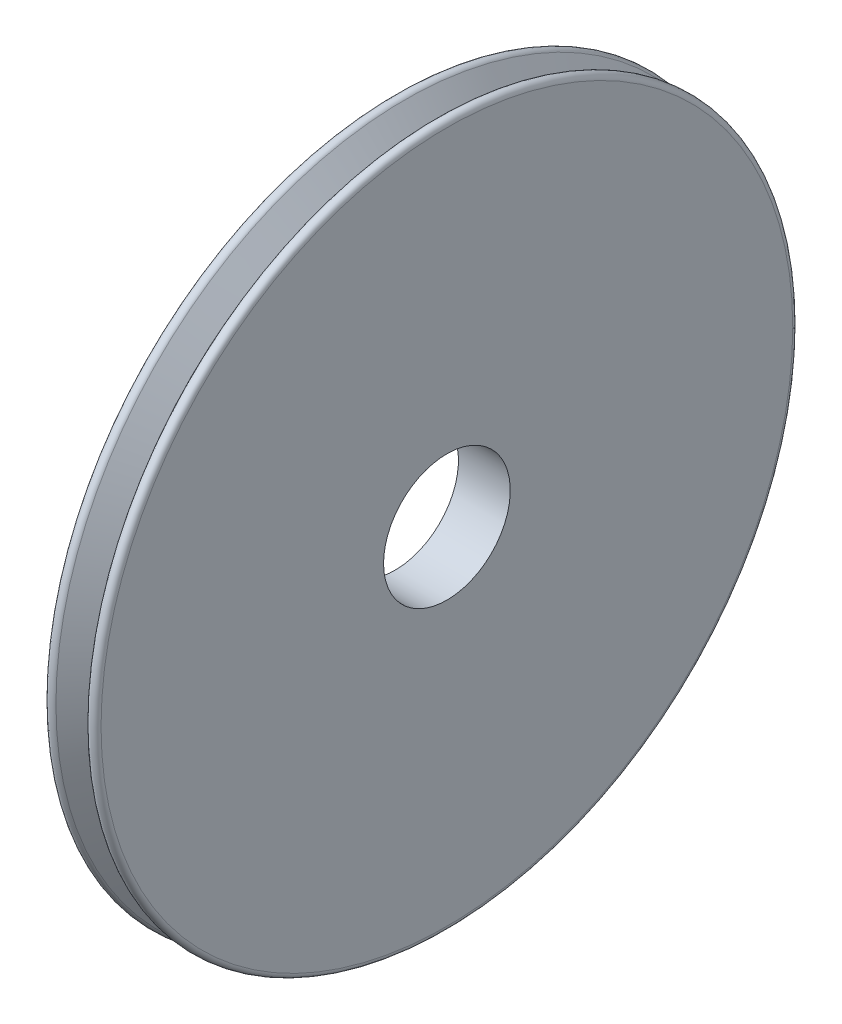
ISO-10303-21;
HEADER;
FILE_DESCRIPTION(('STEP AP214'),'2;1');
FILE_NAME('part.step','',(''),(''),'','','');
FILE_SCHEMA(('AUTOMOTIVE_DESIGN { 1 0 10303 214 1 1 1 1 }'));
ENDSEC;
DATA;
#1=APPLICATION_CONTEXT('core data for automotive mechanical design processes');
#2=APPLICATION_PROTOCOL_DEFINITION('international standard','automotive_design',2000,#1);
#3=PRODUCT_CONTEXT('',#1,'mechanical');
#4=PRODUCT('Part','Part','',(#3));
#5=PRODUCT_RELATED_PRODUCT_CATEGORY('part','',(#4));
#6=PRODUCT_DEFINITION_FORMATION('','',#4);
#7=PRODUCT_DEFINITION_CONTEXT('part definition',#1,'design');
#8=PRODUCT_DEFINITION('design','',#6,#7);
#9=PRODUCT_DEFINITION_SHAPE('','',#8);
#10=(LENGTH_UNIT() NAMED_UNIT(*) SI_UNIT(.MILLI.,.METRE.));
#11=(NAMED_UNIT(*) PLANE_ANGLE_UNIT() SI_UNIT($,.RADIAN.));
#12=(NAMED_UNIT(*) SI_UNIT($,.STERADIAN.) SOLID_ANGLE_UNIT());
#13=UNCERTAINTY_MEASURE_WITH_UNIT(LENGTH_MEASURE(1.E-05),#10,'distance_accuracy_value','');
#14=(GEOMETRIC_REPRESENTATION_CONTEXT(3) GLOBAL_UNCERTAINTY_ASSIGNED_CONTEXT((#13)) GLOBAL_UNIT_ASSIGNED_CONTEXT((#10,
#11,#12)) REPRESENTATION_CONTEXT('',''));
#15=CARTESIAN_POINT('',(0.,0.,0.));
#16=DIRECTION('',(0.,0.,1.));
#17=DIRECTION('',(1.,0.,0.));
#18=AXIS2_PLACEMENT_3D('',#15,#16,#17);
#19=CARTESIAN_POINT('',(-3.57,0.,0.));
#20=DIRECTION('',(-1.,0.,0.));
#21=DIRECTION('',(0.,0.,1.));
#22=AXIS2_PLACEMENT_3D('',#19,#20,#21);
#23=PLANE('',#22);
#24=CARTESIAN_POINT('',(-3.57,0.,0.));
#25=DIRECTION('',(-1.,0.,0.));
#26=DIRECTION('',(0.,0.,1.));
#27=AXIS2_PLACEMENT_3D('',#24,#25,#26);
#28=CIRCLE('',#27,8.73);
#29=CARTESIAN_POINT('',(-3.57,0.,8.73));
#30=VERTEX_POINT('',#29);
#31=EDGE_CURVE('E73',#30,#30,#28,.T.);
#32=ORIENTED_EDGE('',*,*,#31,.F.);
#33=EDGE_LOOP('',(#32));
#34=FACE_BOUND('',#33,.T.);
#35=CARTESIAN_POINT('',(-3.57,0.,0.));
#36=DIRECTION('',(-1.,0.,0.));
#37=DIRECTION('',(0.,0.,1.));
#38=AXIS2_PLACEMENT_3D('',#35,#36,#37);
#39=CIRCLE('',#38,47.6588891139517);
#40=CARTESIAN_POINT('',(-3.57,0.,47.6588891139517));
#41=VERTEX_POINT('',#40);
#42=EDGE_CURVE('E65',#41,#41,#39,.T.);
#43=ORIENTED_EDGE('',*,*,#42,.T.);
#44=EDGE_LOOP('',(#43));
#45=FACE_BOUND('',#44,.T.);
#46=ADVANCED_FACE('F45',(#34,#45),#23,.T.);
#47=CARTESIAN_POINT('',(3.57,0.,0.));
#48=DIRECTION('',(-1.,0.,0.));
#49=DIRECTION('',(0.,0.,1.));
#50=AXIS2_PLACEMENT_3D('',#47,#48,#49);
#51=PLANE('',#50);
#52=CARTESIAN_POINT('',(3.57,0.,0.));
#53=DIRECTION('',(-1.,0.,0.));
#54=DIRECTION('',(0.,0.,1.));
#55=AXIS2_PLACEMENT_3D('',#52,#53,#54);
#56=CIRCLE('',#55,8.73);
#57=CARTESIAN_POINT('',(3.57,0.,8.73));
#58=VERTEX_POINT('',#57);
#59=EDGE_CURVE('E49',#58,#58,#56,.T.);
#60=ORIENTED_EDGE('',*,*,#59,.T.);
#61=EDGE_LOOP('',(#60));
#62=FACE_BOUND('',#61,.T.);
#63=CARTESIAN_POINT('',(3.57,0.,0.));
#64=DIRECTION('',(-1.,0.,0.));
#65=DIRECTION('',(0.,0.,1.));
#66=AXIS2_PLACEMENT_3D('',#63,#64,#65);
#67=CIRCLE('',#66,47.6588891139518);
#68=CARTESIAN_POINT('',(3.57,0.,47.6588891139518));
#69=VERTEX_POINT('',#68);
#70=EDGE_CURVE('E10',#69,#69,#67,.F.);
#71=ORIENTED_EDGE('',*,*,#70,.T.);
#72=EDGE_LOOP('',(#71));
#73=FACE_BOUND('',#72,.T.);
#74=ADVANCED_FACE('F82',(#62,#73),#51,.F.);
#75=CARTESIAN_POINT('',(3.57,0.,0.));
#76=DIRECTION('',(1.,0.,0.));
#77=DIRECTION('',(0.,0.,-1.));
#78=AXIS2_PLACEMENT_3D('',#75,#76,#77);
#79=CONICAL_SURFACE('',#78,50.,0.950736055568568);
#80=CARTESIAN_POINT('',(2.20961742338803,0.,0.));
#81=DIRECTION('',(-1.,0.,0.));
#82=DIRECTION('',(0.,0.,1.));
#83=AXIS2_PLACEMENT_3D('',#80,#81,#82);
#84=CIRCLE('',#83,48.0947022736527);
#85=CARTESIAN_POINT('',(2.20961742338803,0.,48.0947022736527));
#86=VERTEX_POINT('',#85);
#87=EDGE_CURVE('E54',#86,#86,#84,.T.);
#88=ORIENTED_EDGE('',*,*,#87,.T.);
#89=EDGE_LOOP('',(#88));
#90=FACE_BOUND('',#89,.T.);
#91=CARTESIAN_POINT('',(0.,0.,0.));
#92=DIRECTION('',(-1.,0.,0.));
#93=DIRECTION('',(0.,0.,1.));
#94=AXIS2_PLACEMENT_3D('',#91,#92,#93);
#95=CIRCLE('',#94,45.);
#96=CARTESIAN_POINT('',(0.,0.,45.));
#97=VERTEX_POINT('',#96);
#98=EDGE_CURVE('E69',#97,#97,#95,.T.);
#99=ORIENTED_EDGE('',*,*,#98,.F.);
#100=EDGE_LOOP('',(#99));
#101=FACE_BOUND('',#100,.T.);
#102=ADVANCED_FACE('F99',(#90,#101),#79,.T.);
#103=CARTESIAN_POINT('',(-3.57,0.,0.));
#104=DIRECTION('',(-1.,0.,0.));
#105=DIRECTION('',(0.,0.,1.));
#106=AXIS2_PLACEMENT_3D('',#103,#104,#105);
#107=CONICAL_SURFACE('',#106,50.,0.95073605556857);
#108=CARTESIAN_POINT('',(-2.20961742338802,0.,0.));
#109=DIRECTION('',(1.,0.,0.));
#110=DIRECTION('',(0.,0.,-1.));
#111=AXIS2_PLACEMENT_3D('',#108,#109,#110);
#112=CIRCLE('',#111,48.0947022736527);
#113=CARTESIAN_POINT('',(-2.20961742338802,0.,-48.0947022736527));
#114=VERTEX_POINT('',#113);
#115=EDGE_CURVE('E59',#114,#114,#112,.T.);
#116=ORIENTED_EDGE('',*,*,#115,.T.);
#117=EDGE_LOOP('',(#116));
#118=FACE_BOUND('',#117,.T.);
#119=ORIENTED_EDGE('',*,*,#98,.T.);
#120=EDGE_LOOP('',(#119));
#121=FACE_BOUND('',#120,.T.);
#122=ADVANCED_FACE('F104',(#118,#121),#107,.T.);
#123=CARTESIAN_POINT('',(-2.82,0.,0.));
#124=DIRECTION('',(-1.,0.,0.));
#125=DIRECTION('',(0.,0.,1.));
#126=AXIS2_PLACEMENT_3D('',#123,#124,#125);
#127=TOROIDAL_SURFACE('',#126,47.6588891139517,0.75);
#128=ORIENTED_EDGE('',*,*,#115,.F.);
#129=EDGE_LOOP('',(#128));
#130=FACE_BOUND('',#129,.T.);
#131=ORIENTED_EDGE('',*,*,#42,.F.);
#132=EDGE_LOOP('',(#131));
#133=FACE_BOUND('',#132,.T.);
#134=ADVANCED_FACE('F91',(#130,#133),#127,.T.);
#135=CARTESIAN_POINT('',(2.82,0.,0.));
#136=DIRECTION('',(-1.,0.,0.));
#137=DIRECTION('',(0.,0.,1.));
#138=AXIS2_PLACEMENT_3D('',#135,#136,#137);
#139=TOROIDAL_SURFACE('',#138,47.6588891139518,0.75);
#140=ORIENTED_EDGE('',*,*,#70,.F.);
#141=EDGE_LOOP('',(#140));
#142=FACE_BOUND('',#141,.T.);
#143=ORIENTED_EDGE('',*,*,#87,.F.);
#144=EDGE_LOOP('',(#143));
#145=FACE_BOUND('',#144,.T.);
#146=ADVANCED_FACE('F47',(#142,#145),#139,.T.);
#147=CARTESIAN_POINT('',(-5.,0.,0.));
#148=DIRECTION('',(1.,0.,0.));
#149=DIRECTION('',(0.,0.,-1.));
#150=AXIS2_PLACEMENT_3D('',#147,#148,#149);
#151=CYLINDRICAL_SURFACE('',#150,8.73);
#152=ORIENTED_EDGE('',*,*,#31,.T.);
#153=EDGE_LOOP('',(#152));
#154=FACE_BOUND('',#153,.T.);
#155=ORIENTED_EDGE('',*,*,#59,.F.);
#156=EDGE_LOOP('',(#155));
#157=FACE_BOUND('',#156,.T.);
#158=ADVANCED_FACE('F84',(#154,#157),#151,.F.);
#159=CLOSED_SHELL('',(#46,#74,#102,#122,#134,#146,#158));
#160=MANIFOLD_SOLID_BREP('B2',#159);
#161=ADVANCED_BREP_SHAPE_REPRESENTATION('',(#18,#160),#14);
#162=SHAPE_DEFINITION_REPRESENTATION(#9,#161);
ENDSEC;
END-ISO-10303-21;
